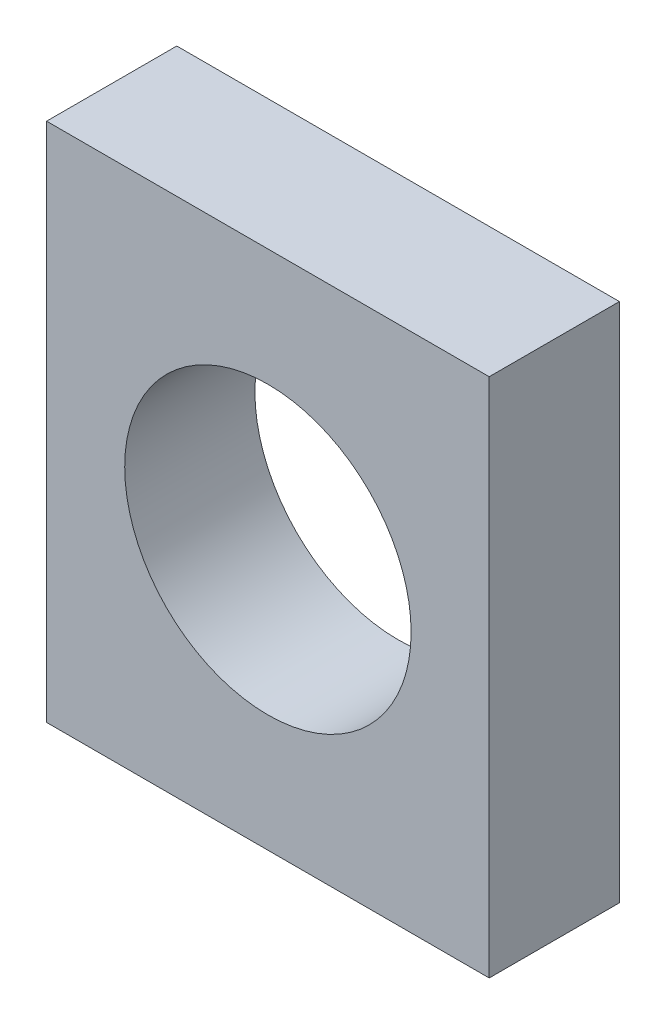
ISO-10303-21;
HEADER;
FILE_DESCRIPTION(('STEP AP214'),'2;1');
FILE_NAME('part.step','',(''),(''),'','','');
FILE_SCHEMA(('AUTOMOTIVE_DESIGN { 1 0 10303 214 1 1 1 1 }'));
ENDSEC;
DATA;
#1=APPLICATION_CONTEXT('core data for automotive mechanical design processes');
#2=APPLICATION_PROTOCOL_DEFINITION('international standard','automotive_design',2000,#1);
#3=PRODUCT_CONTEXT('',#1,'mechanical');
#4=PRODUCT('Part','Part','',(#3));
#5=PRODUCT_RELATED_PRODUCT_CATEGORY('part','',(#4));
#6=PRODUCT_DEFINITION_FORMATION('','',#4);
#7=PRODUCT_DEFINITION_CONTEXT('part definition',#1,'design');
#8=PRODUCT_DEFINITION('design','',#6,#7);
#9=PRODUCT_DEFINITION_SHAPE('','',#8);
#10=(LENGTH_UNIT() NAMED_UNIT(*) SI_UNIT(.MILLI.,.METRE.));
#11=(NAMED_UNIT(*) PLANE_ANGLE_UNIT() SI_UNIT($,.RADIAN.));
#12=(NAMED_UNIT(*) SI_UNIT($,.STERADIAN.) SOLID_ANGLE_UNIT());
#13=UNCERTAINTY_MEASURE_WITH_UNIT(LENGTH_MEASURE(1.E-05),#10,'distance_accuracy_value','');
#14=(GEOMETRIC_REPRESENTATION_CONTEXT(3) GLOBAL_UNCERTAINTY_ASSIGNED_CONTEXT((#13)) GLOBAL_UNIT_ASSIGNED_CONTEXT((#10,
#11,#12)) REPRESENTATION_CONTEXT('',''));
#15=CARTESIAN_POINT('',(0.,0.,0.));
#16=DIRECTION('',(0.,0.,1.));
#17=DIRECTION('',(1.,0.,0.));
#18=AXIS2_PLACEMENT_3D('',#15,#16,#17);
#19=CARTESIAN_POINT('',(-8.5,-10.,5.));
#20=DIRECTION('',(0.,0.,1.));
#21=DIRECTION('',(1.,0.,0.));
#22=AXIS2_PLACEMENT_3D('',#19,#20,#21);
#23=PLANE('',#22);
#24=DIRECTION('',(0.,-1.,0.));
#25=VECTOR('',#24,1.);
#26=CARTESIAN_POINT('',(-8.5,10.,5.));
#27=LINE('',#26,#25);
#28=CARTESIAN_POINT('',(-8.5,10.,5.));
#29=VERTEX_POINT('',#28);
#30=CARTESIAN_POINT('',(-8.5,-10.,5.));
#31=VERTEX_POINT('',#30);
#32=EDGE_CURVE('E83',#29,#31,#27,.T.);
#33=ORIENTED_EDGE('',*,*,#32,.T.);
#34=DIRECTION('',(1.,0.,0.));
#35=VECTOR('',#34,1.);
#36=CARTESIAN_POINT('',(-8.5,-10.,5.));
#37=LINE('',#36,#35);
#38=CARTESIAN_POINT('',(8.5,-10.,5.));
#39=VERTEX_POINT('',#38);
#40=EDGE_CURVE('E78',#31,#39,#37,.T.);
#41=ORIENTED_EDGE('',*,*,#40,.T.);
#42=DIRECTION('',(0.,1.,0.));
#43=VECTOR('',#42,1.);
#44=CARTESIAN_POINT('',(8.5,10.,5.));
#45=LINE('',#44,#43);
#46=CARTESIAN_POINT('',(8.5,10.,5.));
#47=VERTEX_POINT('',#46);
#48=EDGE_CURVE('E81',#39,#47,#45,.T.);
#49=ORIENTED_EDGE('',*,*,#48,.T.);
#50=DIRECTION('',(-1.,0.,0.));
#51=VECTOR('',#50,1.);
#52=CARTESIAN_POINT('',(-8.5,10.,5.));
#53=LINE('',#52,#51);
#54=EDGE_CURVE('E48',#47,#29,#53,.T.);
#55=ORIENTED_EDGE('',*,*,#54,.T.);
#56=EDGE_LOOP('',(#33,#41,#49,#55));
#57=FACE_BOUND('',#56,.T.);
#58=CARTESIAN_POINT('',(0.,0.,5.));
#59=DIRECTION('',(0.,0.,1.));
#60=DIRECTION('',(1.,0.,0.));
#61=AXIS2_PLACEMENT_3D('',#58,#59,#60);
#62=CIRCLE('',#61,5.5);
#63=CARTESIAN_POINT('',(5.5,0.,5.));
#64=VERTEX_POINT('',#63);
#65=EDGE_CURVE('E98',#64,#64,#62,.T.);
#66=ORIENTED_EDGE('',*,*,#65,.F.);
#67=EDGE_LOOP('',(#66));
#68=FACE_BOUND('',#67,.T.);
#69=ADVANCED_FACE('F31',(#57,#68),#23,.T.);
#70=CARTESIAN_POINT('',(-8.5,-10.,0.));
#71=DIRECTION('',(0.,0.,1.));
#72=DIRECTION('',(1.,0.,0.));
#73=AXIS2_PLACEMENT_3D('',#70,#71,#72);
#74=PLANE('',#73);
#75=DIRECTION('',(0.,-1.,0.));
#76=VECTOR('',#75,1.);
#77=CARTESIAN_POINT('',(-8.5,10.,0.));
#78=LINE('',#77,#76);
#79=CARTESIAN_POINT('',(-8.5,10.,0.));
#80=VERTEX_POINT('',#79);
#81=CARTESIAN_POINT('',(-8.5,-10.,0.));
#82=VERTEX_POINT('',#81);
#83=EDGE_CURVE('E95',#80,#82,#78,.T.);
#84=ORIENTED_EDGE('',*,*,#83,.F.);
#85=DIRECTION('',(-1.,0.,0.));
#86=VECTOR('',#85,1.);
#87=CARTESIAN_POINT('',(-8.5,10.,0.));
#88=LINE('',#87,#86);
#89=CARTESIAN_POINT('',(8.5,10.,0.));
#90=VERTEX_POINT('',#89);
#91=EDGE_CURVE('E71',#90,#80,#88,.T.);
#92=ORIENTED_EDGE('',*,*,#91,.F.);
#93=DIRECTION('',(0.,1.,0.));
#94=VECTOR('',#93,1.);
#95=CARTESIAN_POINT('',(8.5,10.,0.));
#96=LINE('',#95,#94);
#97=CARTESIAN_POINT('',(8.5,-10.,0.));
#98=VERTEX_POINT('',#97);
#99=EDGE_CURVE('E65',#98,#90,#96,.T.);
#100=ORIENTED_EDGE('',*,*,#99,.F.);
#101=DIRECTION('',(1.,0.,0.));
#102=VECTOR('',#101,1.);
#103=CARTESIAN_POINT('',(-8.5,-10.,0.));
#104=LINE('',#103,#102);
#105=EDGE_CURVE('E87',#82,#98,#104,.T.);
#106=ORIENTED_EDGE('',*,*,#105,.F.);
#107=EDGE_LOOP('',(#84,#92,#100,#106));
#108=FACE_BOUND('',#107,.T.);
#109=CARTESIAN_POINT('',(0.,0.,0.));
#110=DIRECTION('',(0.,0.,1.));
#111=DIRECTION('',(1.,0.,0.));
#112=AXIS2_PLACEMENT_3D('',#109,#110,#111);
#113=CIRCLE('',#112,5.5);
#114=CARTESIAN_POINT('',(5.5,0.,0.));
#115=VERTEX_POINT('',#114);
#116=EDGE_CURVE('E110',#115,#115,#113,.T.);
#117=ORIENTED_EDGE('',*,*,#116,.T.);
#118=EDGE_LOOP('',(#117));
#119=FACE_BOUND('',#118,.T.);
#120=ADVANCED_FACE('F106',(#108,#119),#74,.F.);
#121=CARTESIAN_POINT('',(-8.5,10.,5.));
#122=DIRECTION('',(1.,0.,0.));
#123=DIRECTION('',(0.,0.,-1.));
#124=AXIS2_PLACEMENT_3D('',#121,#122,#123);
#125=PLANE('',#124);
#126=ORIENTED_EDGE('',*,*,#83,.T.);
#127=DIRECTION('',(0.,0.,-1.));
#128=VECTOR('',#127,1.);
#129=CARTESIAN_POINT('',(-8.5,-10.,5.));
#130=LINE('',#129,#128);
#131=EDGE_CURVE('E11',#31,#82,#130,.T.);
#132=ORIENTED_EDGE('',*,*,#131,.F.);
#133=ORIENTED_EDGE('',*,*,#32,.F.);
#134=DIRECTION('',(0.,0.,-1.));
#135=VECTOR('',#134,1.);
#136=CARTESIAN_POINT('',(-8.5,10.,5.));
#137=LINE('',#136,#135);
#138=EDGE_CURVE('E91',#29,#80,#137,.T.);
#139=ORIENTED_EDGE('',*,*,#138,.T.);
#140=EDGE_LOOP('',(#126,#132,#133,#139));
#141=FACE_BOUND('',#140,.T.);
#142=ADVANCED_FACE('F33',(#141),#125,.F.);
#143=CARTESIAN_POINT('',(-8.5,-10.,5.));
#144=DIRECTION('',(0.,1.,0.));
#145=DIRECTION('',(-1.,0.,0.));
#146=AXIS2_PLACEMENT_3D('',#143,#144,#145);
#147=PLANE('',#146);
#148=ORIENTED_EDGE('',*,*,#105,.T.);
#149=DIRECTION('',(0.,0.,-1.));
#150=VECTOR('',#149,1.);
#151=CARTESIAN_POINT('',(8.5,-10.,5.));
#152=LINE('',#151,#150);
#153=EDGE_CURVE('E40',#39,#98,#152,.T.);
#154=ORIENTED_EDGE('',*,*,#153,.F.);
#155=ORIENTED_EDGE('',*,*,#40,.F.);
#156=ORIENTED_EDGE('',*,*,#131,.T.);
#157=EDGE_LOOP('',(#148,#154,#155,#156));
#158=FACE_BOUND('',#157,.T.);
#159=ADVANCED_FACE('F86',(#158),#147,.F.);
#160=CARTESIAN_POINT('',(8.5,10.,5.));
#161=DIRECTION('',(-1.,0.,0.));
#162=DIRECTION('',(0.,0.,1.));
#163=AXIS2_PLACEMENT_3D('',#160,#161,#162);
#164=PLANE('',#163);
#165=ORIENTED_EDGE('',*,*,#99,.T.);
#166=DIRECTION('',(0.,0.,-1.));
#167=VECTOR('',#166,1.);
#168=CARTESIAN_POINT('',(8.5,10.,5.));
#169=LINE('',#168,#167);
#170=EDGE_CURVE('E88',#47,#90,#169,.T.);
#171=ORIENTED_EDGE('',*,*,#170,.F.);
#172=ORIENTED_EDGE('',*,*,#48,.F.);
#173=ORIENTED_EDGE('',*,*,#153,.T.);
#174=EDGE_LOOP('',(#165,#171,#172,#173));
#175=FACE_BOUND('',#174,.T.);
#176=ADVANCED_FACE('F89',(#175),#164,.F.);
#177=CARTESIAN_POINT('',(-8.5,10.,5.));
#178=DIRECTION('',(0.,-1.,0.));
#179=DIRECTION('',(1.,0.,0.));
#180=AXIS2_PLACEMENT_3D('',#177,#178,#179);
#181=PLANE('',#180);
#182=ORIENTED_EDGE('',*,*,#91,.T.);
#183=ORIENTED_EDGE('',*,*,#138,.F.);
#184=ORIENTED_EDGE('',*,*,#54,.F.);
#185=ORIENTED_EDGE('',*,*,#170,.T.);
#186=EDGE_LOOP('',(#182,#183,#184,#185));
#187=FACE_BOUND('',#186,.T.);
#188=ADVANCED_FACE('F103',(#187),#181,.F.);
#189=CARTESIAN_POINT('',(0.,0.,5.));
#190=DIRECTION('',(0.,0.,-1.));
#191=DIRECTION('',(-1.,0.,0.));
#192=AXIS2_PLACEMENT_3D('',#189,#190,#191);
#193=CYLINDRICAL_SURFACE('',#192,5.5);
#194=ORIENTED_EDGE('',*,*,#65,.T.);
#195=EDGE_LOOP('',(#194));
#196=FACE_BOUND('',#195,.T.);
#197=ORIENTED_EDGE('',*,*,#116,.F.);
#198=EDGE_LOOP('',(#197));
#199=FACE_BOUND('',#198,.T.);
#200=ADVANCED_FACE('F116',(#196,#199),#193,.F.);
#201=CLOSED_SHELL('',(#69,#120,#142,#159,#176,#188,#200));
#202=MANIFOLD_SOLID_BREP('B2',#201);
#203=ADVANCED_BREP_SHAPE_REPRESENTATION('',(#18,#202),#14);
#204=SHAPE_DEFINITION_REPRESENTATION(#9,#203);
ENDSEC;
END-ISO-10303-21;
